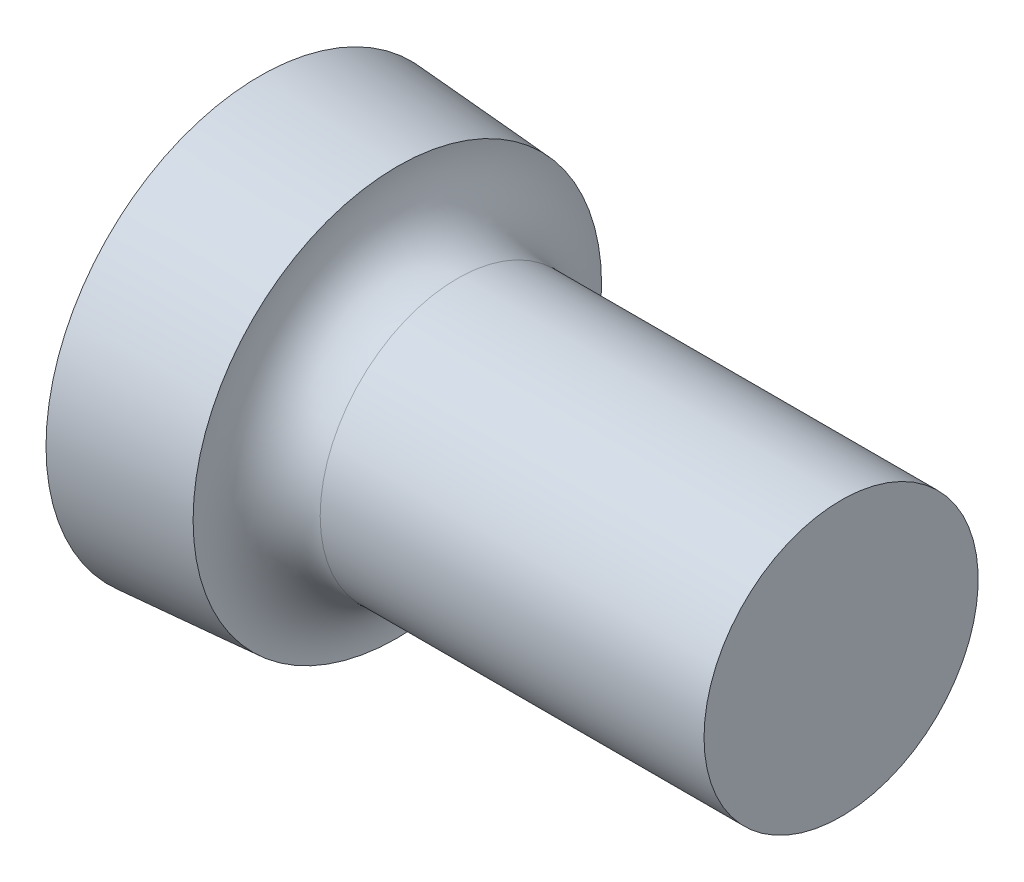
ISO-10303-21;
HEADER;
FILE_DESCRIPTION(('STEP AP214'),'2;1');
FILE_NAME('part.step','',(''),(''),'','','');
FILE_SCHEMA(('AUTOMOTIVE_DESIGN { 1 0 10303 214 1 1 1 1 }'));
ENDSEC;
DATA;
#1=APPLICATION_CONTEXT('core data for automotive mechanical design processes');
#2=APPLICATION_PROTOCOL_DEFINITION('international standard','automotive_design',2000,#1);
#3=PRODUCT_CONTEXT('',#1,'mechanical');
#4=PRODUCT('Part','Part','',(#3));
#5=PRODUCT_RELATED_PRODUCT_CATEGORY('part','',(#4));
#6=PRODUCT_DEFINITION_FORMATION('','',#4);
#7=PRODUCT_DEFINITION_CONTEXT('part definition',#1,'design');
#8=PRODUCT_DEFINITION('design','',#6,#7);
#9=PRODUCT_DEFINITION_SHAPE('','',#8);
#10=(LENGTH_UNIT() NAMED_UNIT(*) SI_UNIT(.MILLI.,.METRE.));
#11=(NAMED_UNIT(*) PLANE_ANGLE_UNIT() SI_UNIT($,.RADIAN.));
#12=(NAMED_UNIT(*) SI_UNIT($,.STERADIAN.) SOLID_ANGLE_UNIT());
#13=UNCERTAINTY_MEASURE_WITH_UNIT(LENGTH_MEASURE(1.E-05),#10,'distance_accuracy_value','');
#14=(GEOMETRIC_REPRESENTATION_CONTEXT(3) GLOBAL_UNCERTAINTY_ASSIGNED_CONTEXT((#13)) GLOBAL_UNIT_ASSIGNED_CONTEXT((#10,
#11,#12)) REPRESENTATION_CONTEXT('',''));
#15=CARTESIAN_POINT('',(0.,0.,0.));
#16=DIRECTION('',(0.,0.,1.));
#17=DIRECTION('',(1.,0.,0.));
#18=AXIS2_PLACEMENT_3D('',#15,#16,#17);
#19=CARTESIAN_POINT('',(0.,1.95,0.));
#20=DIRECTION('',(1.,0.,0.));
#21=DIRECTION('',(0.,0.,-1.));
#22=AXIS2_PLACEMENT_3D('',#19,#20,#21);
#23=PLANE('',#22);
#24=CARTESIAN_POINT('',(0.,0.,0.));
#25=DIRECTION('',(-1.,0.,0.));
#26=DIRECTION('',(0.,0.,1.));
#27=AXIS2_PLACEMENT_3D('',#24,#25,#26);
#28=CIRCLE('',#27,1.95);
#29=CARTESIAN_POINT('',(0.,0.,1.95));
#30=VERTEX_POINT('',#29);
#31=EDGE_CURVE('E10',#30,#30,#28,.T.);
#32=ORIENTED_EDGE('',*,*,#31,.T.);
#33=EDGE_LOOP('',(#32));
#34=FACE_BOUND('',#33,.T.);
#35=ADVANCED_FACE('F31',(#34),#23,.F.);
#36=CARTESIAN_POINT('',(1.25354481010212,0.,0.));
#37=DIRECTION('',(-1.,0.,0.));
#38=DIRECTION('',(0.,0.,1.));
#39=AXIS2_PLACEMENT_3D('',#36,#37,#38);
#40=CONICAL_SURFACE('',#39,1.86234360780123,0.069813170079773);
#41=ORIENTED_EDGE('',*,*,#31,.F.);
#42=EDGE_LOOP('',(#41));
#43=FACE_BOUND('',#42,.T.);
#44=CARTESIAN_POINT('',(1.25354481010212,0.,0.));
#45=DIRECTION('',(-1.,0.,0.));
#46=DIRECTION('',(0.,0.,1.));
#47=AXIS2_PLACEMENT_3D('',#44,#45,#46);
#48=CIRCLE('',#47,1.86234360780123);
#49=CARTESIAN_POINT('',(1.25354481010212,0.,1.86234360780123));
#50=VERTEX_POINT('',#49);
#51=EDGE_CURVE('E37',#50,#50,#48,.T.);
#52=ORIENTED_EDGE('',*,*,#51,.T.);
#53=EDGE_LOOP('',(#52));
#54=FACE_BOUND('',#53,.T.);
#55=ADVANCED_FACE('F63',(#43,#54),#40,.T.);
#56=CARTESIAN_POINT('',(1.8,0.,0.));
#57=DIRECTION('',(-1.,0.,0.));
#58=DIRECTION('',(0.,0.,1.));
#59=AXIS2_PLACEMENT_3D('',#56,#57,#58);
#60=TOROIDAL_SURFACE('',#59,1.8,0.55);
#61=ORIENTED_EDGE('',*,*,#51,.F.);
#62=EDGE_LOOP('',(#61));
#63=FACE_BOUND('',#62,.T.);
#64=CARTESIAN_POINT('',(1.8,0.,0.));
#65=DIRECTION('',(-1.,0.,0.));
#66=DIRECTION('',(0.,0.,1.));
#67=AXIS2_PLACEMENT_3D('',#64,#65,#66);
#68=CIRCLE('',#67,1.25);
#69=CARTESIAN_POINT('',(1.8,0.,1.25));
#70=VERTEX_POINT('',#69);
#71=EDGE_CURVE('E41',#70,#70,#68,.T.);
#72=ORIENTED_EDGE('',*,*,#71,.T.);
#73=EDGE_LOOP('',(#72));
#74=FACE_BOUND('',#73,.T.);
#75=ADVANCED_FACE('F59',(#63,#74),#60,.F.);
#76=CARTESIAN_POINT('',(0.,0.,0.));
#77=DIRECTION('',(-1.,0.,0.));
#78=DIRECTION('',(0.,0.,1.));
#79=AXIS2_PLACEMENT_3D('',#76,#77,#78);
#80=CYLINDRICAL_SURFACE('',#79,1.25);
#81=ORIENTED_EDGE('',*,*,#71,.F.);
#82=EDGE_LOOP('',(#81));
#83=FACE_BOUND('',#82,.T.);
#84=CARTESIAN_POINT('',(5.3,0.,0.));
#85=DIRECTION('',(-1.,0.,0.));
#86=DIRECTION('',(0.,0.,1.));
#87=AXIS2_PLACEMENT_3D('',#84,#85,#86);
#88=CIRCLE('',#87,1.25);
#89=CARTESIAN_POINT('',(5.3,0.,1.25));
#90=VERTEX_POINT('',#89);
#91=EDGE_CURVE('E45',#90,#90,#88,.T.);
#92=ORIENTED_EDGE('',*,*,#91,.T.);
#93=EDGE_LOOP('',(#92));
#94=FACE_BOUND('',#93,.T.);
#95=ADVANCED_FACE('F51',(#83,#94),#80,.T.);
#96=CARTESIAN_POINT('',(5.3,0.,0.));
#97=DIRECTION('',(-1.,0.,0.));
#98=DIRECTION('',(0.,0.,1.));
#99=AXIS2_PLACEMENT_3D('',#96,#97,#98);
#100=PLANE('',#99);
#101=ORIENTED_EDGE('',*,*,#91,.F.);
#102=EDGE_LOOP('',(#101));
#103=FACE_BOUND('',#102,.T.);
#104=ADVANCED_FACE('F53',(#103),#100,.F.);
#105=CLOSED_SHELL('',(#35,#55,#75,#95,#104));
#106=MANIFOLD_SOLID_BREP('B2',#105);
#107=ADVANCED_BREP_SHAPE_REPRESENTATION('',(#18,#106),#14);
#108=SHAPE_DEFINITION_REPRESENTATION(#9,#107);
ENDSEC;
END-ISO-10303-21;
